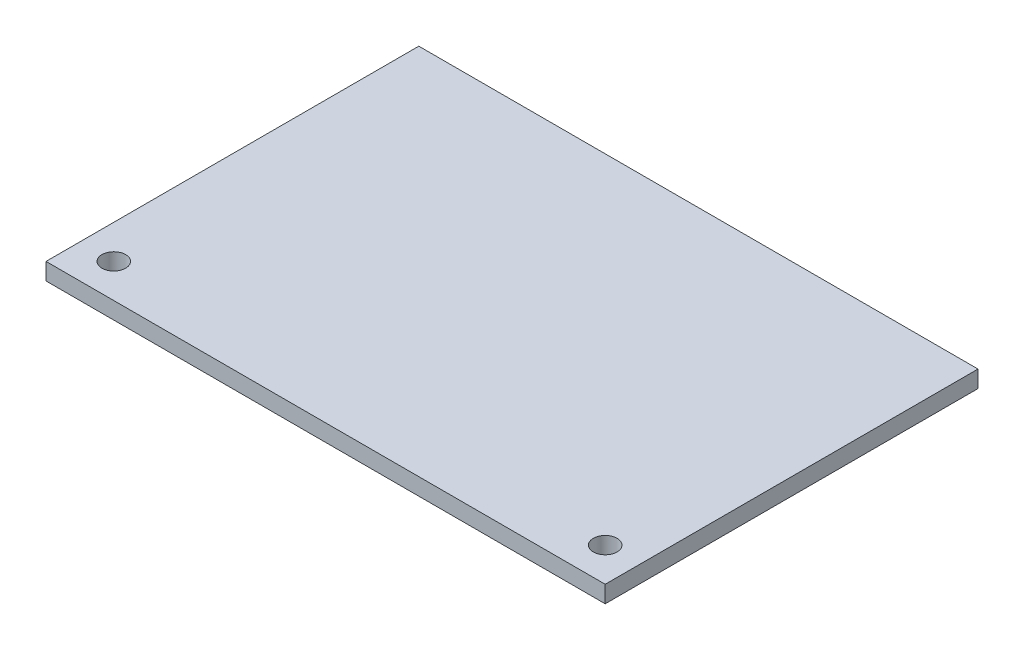
ISO-10303-21;
HEADER;
FILE_DESCRIPTION(('STEP AP214'),'2;1');
FILE_NAME('part.step','',(''),(''),'','','');
FILE_SCHEMA(('AUTOMOTIVE_DESIGN { 1 0 10303 214 1 1 1 1 }'));
ENDSEC;
DATA;
#1=APPLICATION_CONTEXT('core data for automotive mechanical design processes');
#2=APPLICATION_PROTOCOL_DEFINITION('international standard','automotive_design',2000,#1);
#3=PRODUCT_CONTEXT('',#1,'mechanical');
#4=PRODUCT('Part','Part','',(#3));
#5=PRODUCT_RELATED_PRODUCT_CATEGORY('part','',(#4));
#6=PRODUCT_DEFINITION_FORMATION('','',#4);
#7=PRODUCT_DEFINITION_CONTEXT('part definition',#1,'design');
#8=PRODUCT_DEFINITION('design','',#6,#7);
#9=PRODUCT_DEFINITION_SHAPE('','',#8);
#10=(LENGTH_UNIT() NAMED_UNIT(*) SI_UNIT(.MILLI.,.METRE.));
#11=(NAMED_UNIT(*) PLANE_ANGLE_UNIT() SI_UNIT($,.RADIAN.));
#12=(NAMED_UNIT(*) SI_UNIT($,.STERADIAN.) SOLID_ANGLE_UNIT());
#13=UNCERTAINTY_MEASURE_WITH_UNIT(LENGTH_MEASURE(1.E-05),#10,'distance_accuracy_value','');
#14=(GEOMETRIC_REPRESENTATION_CONTEXT(3) GLOBAL_UNCERTAINTY_ASSIGNED_CONTEXT((#13)) GLOBAL_UNIT_ASSIGNED_CONTEXT((#10,
#11,#12)) REPRESENTATION_CONTEXT('',''));
#15=CARTESIAN_POINT('',(0.,0.,0.));
#16=DIRECTION('',(0.,0.,1.));
#17=DIRECTION('',(1.,0.,0.));
#18=AXIS2_PLACEMENT_3D('',#15,#16,#17);
#19=CARTESIAN_POINT('',(0.,5.,0.));
#20=DIRECTION('',(0.,1.,0.));
#21=DIRECTION('',(0.,0.,1.));
#22=AXIS2_PLACEMENT_3D('',#19,#20,#21);
#23=PLANE('',#22);
#24=CARTESIAN_POINT('',(72.5,5.,45.));
#25=DIRECTION('',(0.,1.,0.));
#26=DIRECTION('',(0.,0.,1.));
#27=AXIS2_PLACEMENT_3D('',#24,#25,#26);
#28=CIRCLE('',#27,3.50000000000001);
#29=CARTESIAN_POINT('',(72.5,5.,48.5));
#30=VERTEX_POINT('',#29);
#31=EDGE_CURVE('E112',#30,#30,#28,.T.);
#32=ORIENTED_EDGE('',*,*,#31,.F.);
#33=EDGE_LOOP('',(#32));
#34=FACE_BOUND('',#33,.T.);
#35=DIRECTION('',(0.,0.,-1.));
#36=VECTOR('',#35,1.);
#37=CARTESIAN_POINT('',(82.5,5.,-55.));
#38=LINE('',#37,#36);
#39=CARTESIAN_POINT('',(82.5,5.,55.));
#40=VERTEX_POINT('',#39);
#41=CARTESIAN_POINT('',(82.5,5.,-55.));
#42=VERTEX_POINT('',#41);
#43=EDGE_CURVE('E92',#40,#42,#38,.T.);
#44=ORIENTED_EDGE('',*,*,#43,.T.);
#45=DIRECTION('',(-1.,0.,0.));
#46=VECTOR('',#45,1.);
#47=CARTESIAN_POINT('',(-82.5,5.,-55.));
#48=LINE('',#47,#46);
#49=CARTESIAN_POINT('',(-82.5,5.,-55.));
#50=VERTEX_POINT('',#49);
#51=EDGE_CURVE('E87',#42,#50,#48,.T.);
#52=ORIENTED_EDGE('',*,*,#51,.T.);
#53=DIRECTION('',(0.,0.,1.));
#54=VECTOR('',#53,1.);
#55=CARTESIAN_POINT('',(-82.5,5.,-55.));
#56=LINE('',#55,#54);
#57=CARTESIAN_POINT('',(-82.5,5.,55.));
#58=VERTEX_POINT('',#57);
#59=EDGE_CURVE('E90',#50,#58,#56,.T.);
#60=ORIENTED_EDGE('',*,*,#59,.T.);
#61=DIRECTION('',(1.,0.,0.));
#62=VECTOR('',#61,1.);
#63=CARTESIAN_POINT('',(-82.5,5.,55.));
#64=LINE('',#63,#62);
#65=EDGE_CURVE('E57',#58,#40,#64,.T.);
#66=ORIENTED_EDGE('',*,*,#65,.T.);
#67=EDGE_LOOP('',(#44,#52,#60,#66));
#68=FACE_BOUND('',#67,.T.);
#69=CARTESIAN_POINT('',(-72.5,5.,45.));
#70=DIRECTION('',(0.,1.,0.));
#71=DIRECTION('',(0.,0.,1.));
#72=AXIS2_PLACEMENT_3D('',#69,#70,#71);
#73=CIRCLE('',#72,3.50000000000001);
#74=CARTESIAN_POINT('',(-72.5,5.,48.5));
#75=VERTEX_POINT('',#74);
#76=EDGE_CURVE('E134',#75,#75,#73,.T.);
#77=ORIENTED_EDGE('',*,*,#76,.F.);
#78=EDGE_LOOP('',(#77));
#79=FACE_BOUND('',#78,.T.);
#80=ADVANCED_FACE('F39',(#34,#68,#79),#23,.T.);
#81=CARTESIAN_POINT('',(0.,0.,0.));
#82=DIRECTION('',(0.,1.,0.));
#83=DIRECTION('',(0.,0.,1.));
#84=AXIS2_PLACEMENT_3D('',#81,#82,#83);
#85=PLANE('',#84);
#86=DIRECTION('',(0.,0.,-1.));
#87=VECTOR('',#86,1.);
#88=CARTESIAN_POINT('',(82.5,0.,-55.));
#89=LINE('',#88,#87);
#90=CARTESIAN_POINT('',(82.5,0.,55.));
#91=VERTEX_POINT('',#90);
#92=CARTESIAN_POINT('',(82.5,0.,-55.));
#93=VERTEX_POINT('',#92);
#94=EDGE_CURVE('E108',#91,#93,#89,.T.);
#95=ORIENTED_EDGE('',*,*,#94,.F.);
#96=DIRECTION('',(1.,0.,0.));
#97=VECTOR('',#96,1.);
#98=CARTESIAN_POINT('',(-82.5,0.,55.));
#99=LINE('',#98,#97);
#100=CARTESIAN_POINT('',(-82.5,0.,55.));
#101=VERTEX_POINT('',#100);
#102=EDGE_CURVE('E80',#101,#91,#99,.T.);
#103=ORIENTED_EDGE('',*,*,#102,.F.);
#104=DIRECTION('',(0.,0.,1.));
#105=VECTOR('',#104,1.);
#106=CARTESIAN_POINT('',(-82.5,0.,-55.));
#107=LINE('',#106,#105);
#108=CARTESIAN_POINT('',(-82.5,0.,-55.));
#109=VERTEX_POINT('',#108);
#110=EDGE_CURVE('E74',#109,#101,#107,.T.);
#111=ORIENTED_EDGE('',*,*,#110,.F.);
#112=DIRECTION('',(-1.,0.,0.));
#113=VECTOR('',#112,1.);
#114=CARTESIAN_POINT('',(-82.5,0.,-55.));
#115=LINE('',#114,#113);
#116=EDGE_CURVE('E97',#93,#109,#115,.T.);
#117=ORIENTED_EDGE('',*,*,#116,.F.);
#118=EDGE_LOOP('',(#95,#103,#111,#117));
#119=FACE_BOUND('',#118,.T.);
#120=CARTESIAN_POINT('',(72.5,0.,45.));
#121=DIRECTION('',(0.,1.,0.));
#122=DIRECTION('',(0.,0.,1.));
#123=AXIS2_PLACEMENT_3D('',#120,#121,#122);
#124=CIRCLE('',#123,3.50000000000001);
#125=CARTESIAN_POINT('',(72.5,0.,48.5));
#126=VERTEX_POINT('',#125);
#127=EDGE_CURVE('E130',#126,#126,#124,.T.);
#128=ORIENTED_EDGE('',*,*,#127,.T.);
#129=EDGE_LOOP('',(#128));
#130=FACE_BOUND('',#129,.T.);
#131=CARTESIAN_POINT('',(-72.5,0.,45.));
#132=DIRECTION('',(0.,1.,0.));
#133=DIRECTION('',(0.,0.,1.));
#134=AXIS2_PLACEMENT_3D('',#131,#132,#133);
#135=CIRCLE('',#134,3.50000000000001);
#136=CARTESIAN_POINT('',(-72.5,0.,48.5));
#137=VERTEX_POINT('',#136);
#138=EDGE_CURVE('E138',#137,#137,#135,.T.);
#139=ORIENTED_EDGE('',*,*,#138,.T.);
#140=EDGE_LOOP('',(#139));
#141=FACE_BOUND('',#140,.T.);
#142=ADVANCED_FACE('F125',(#119,#130,#141),#85,.F.);
#143=CARTESIAN_POINT('',(82.5,5.,-55.));
#144=DIRECTION('',(-1.,0.,0.));
#145=DIRECTION('',(0.,0.,1.));
#146=AXIS2_PLACEMENT_3D('',#143,#144,#145);
#147=PLANE('',#146);
#148=ORIENTED_EDGE('',*,*,#94,.T.);
#149=DIRECTION('',(0.,-1.,0.));
#150=VECTOR('',#149,1.);
#151=CARTESIAN_POINT('',(82.5,5.,-55.));
#152=LINE('',#151,#150);
#153=EDGE_CURVE('E11',#42,#93,#152,.T.);
#154=ORIENTED_EDGE('',*,*,#153,.F.);
#155=ORIENTED_EDGE('',*,*,#43,.F.);
#156=DIRECTION('',(0.,-1.,0.));
#157=VECTOR('',#156,1.);
#158=CARTESIAN_POINT('',(82.5,5.,55.));
#159=LINE('',#158,#157);
#160=EDGE_CURVE('E104',#40,#91,#159,.T.);
#161=ORIENTED_EDGE('',*,*,#160,.T.);
#162=EDGE_LOOP('',(#148,#154,#155,#161));
#163=FACE_BOUND('',#162,.T.);
#164=ADVANCED_FACE('F41',(#163),#147,.F.);
#165=CARTESIAN_POINT('',(-82.5,5.,-55.));
#166=DIRECTION('',(0.,0.,1.));
#167=DIRECTION('',(1.,0.,0.));
#168=AXIS2_PLACEMENT_3D('',#165,#166,#167);
#169=PLANE('',#168);
#170=ORIENTED_EDGE('',*,*,#116,.T.);
#171=DIRECTION('',(0.,-1.,0.));
#172=VECTOR('',#171,1.);
#173=CARTESIAN_POINT('',(-82.5,5.,-55.));
#174=LINE('',#173,#172);
#175=EDGE_CURVE('E49',#50,#109,#174,.T.);
#176=ORIENTED_EDGE('',*,*,#175,.F.);
#177=ORIENTED_EDGE('',*,*,#51,.F.);
#178=ORIENTED_EDGE('',*,*,#153,.T.);
#179=EDGE_LOOP('',(#170,#176,#177,#178));
#180=FACE_BOUND('',#179,.T.);
#181=ADVANCED_FACE('F96',(#180),#169,.F.);
#182=CARTESIAN_POINT('',(-82.5,5.,-55.));
#183=DIRECTION('',(1.,0.,0.));
#184=DIRECTION('',(0.,0.,-1.));
#185=AXIS2_PLACEMENT_3D('',#182,#183,#184);
#186=PLANE('',#185);
#187=ORIENTED_EDGE('',*,*,#110,.T.);
#188=DIRECTION('',(0.,-1.,0.));
#189=VECTOR('',#188,1.);
#190=CARTESIAN_POINT('',(-82.5,5.,55.));
#191=LINE('',#190,#189);
#192=EDGE_CURVE('E99',#58,#101,#191,.T.);
#193=ORIENTED_EDGE('',*,*,#192,.F.);
#194=ORIENTED_EDGE('',*,*,#59,.F.);
#195=ORIENTED_EDGE('',*,*,#175,.T.);
#196=EDGE_LOOP('',(#187,#193,#194,#195));
#197=FACE_BOUND('',#196,.T.);
#198=ADVANCED_FACE('F100',(#197),#186,.F.);
#199=CARTESIAN_POINT('',(-82.5,5.,55.));
#200=DIRECTION('',(0.,0.,-1.));
#201=DIRECTION('',(-1.,0.,0.));
#202=AXIS2_PLACEMENT_3D('',#199,#200,#201);
#203=PLANE('',#202);
#204=ORIENTED_EDGE('',*,*,#102,.T.);
#205=ORIENTED_EDGE('',*,*,#160,.F.);
#206=ORIENTED_EDGE('',*,*,#65,.F.);
#207=ORIENTED_EDGE('',*,*,#192,.T.);
#208=EDGE_LOOP('',(#204,#205,#206,#207));
#209=FACE_BOUND('',#208,.T.);
#210=ADVANCED_FACE('F122',(#209),#203,.F.);
#211=CARTESIAN_POINT('',(72.5,5.,45.));
#212=DIRECTION('',(0.,-1.,0.));
#213=DIRECTION('',(0.,0.,-1.));
#214=AXIS2_PLACEMENT_3D('',#211,#212,#213);
#215=CYLINDRICAL_SURFACE('',#214,3.50000000000001);
#216=ORIENTED_EDGE('',*,*,#31,.T.);
#217=EDGE_LOOP('',(#216));
#218=FACE_BOUND('',#217,.T.);
#219=ORIENTED_EDGE('',*,*,#127,.F.);
#220=EDGE_LOOP('',(#219));
#221=FACE_BOUND('',#220,.T.);
#222=ADVANCED_FACE('F157',(#218,#221),#215,.F.);
#223=CARTESIAN_POINT('',(-72.5,5.,45.));
#224=DIRECTION('',(0.,-1.,0.));
#225=DIRECTION('',(0.,0.,-1.));
#226=AXIS2_PLACEMENT_3D('',#223,#224,#225);
#227=CYLINDRICAL_SURFACE('',#226,3.50000000000001);
#228=ORIENTED_EDGE('',*,*,#76,.T.);
#229=EDGE_LOOP('',(#228));
#230=FACE_BOUND('',#229,.T.);
#231=ORIENTED_EDGE('',*,*,#138,.F.);
#232=EDGE_LOOP('',(#231));
#233=FACE_BOUND('',#232,.T.);
#234=ADVANCED_FACE('F146',(#230,#233),#227,.F.);
#235=CLOSED_SHELL('',(#80,#142,#164,#181,#198,#210,#222,#234));
#236=MANIFOLD_SOLID_BREP('B2',#235);
#237=ADVANCED_BREP_SHAPE_REPRESENTATION('',(#18,#236),#14);
#238=SHAPE_DEFINITION_REPRESENTATION(#9,#237);
ENDSEC;
END-ISO-10303-21;
